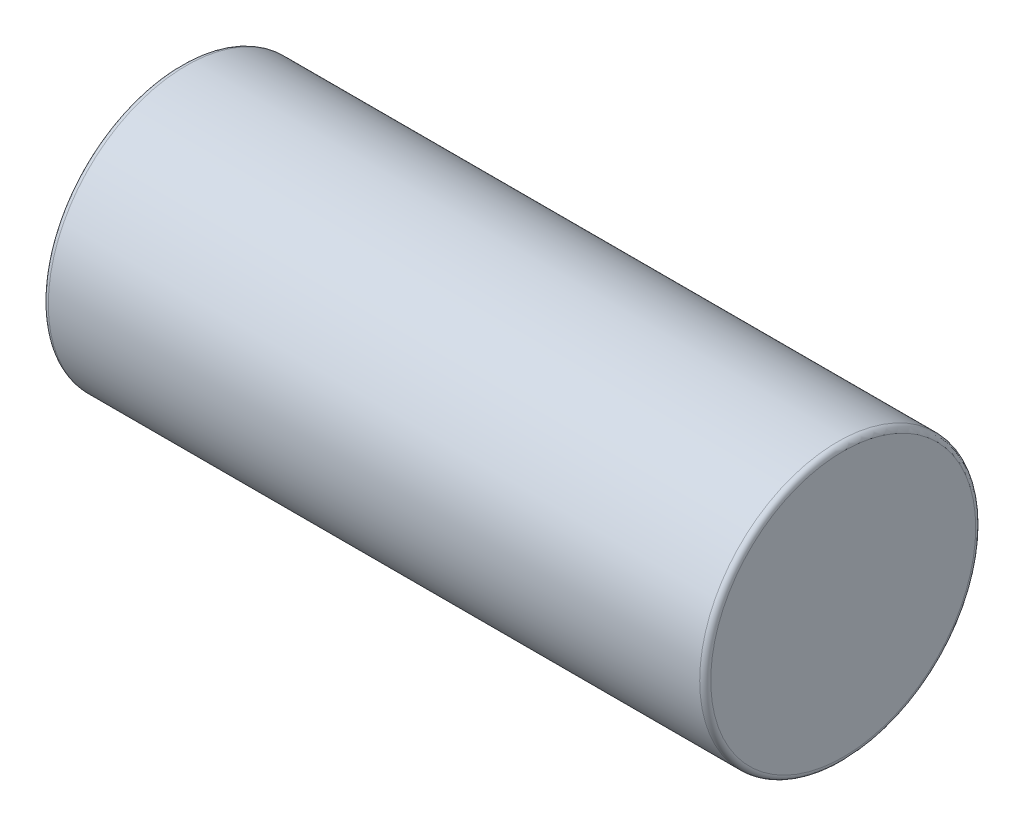
ISO-10303-21;
HEADER;
FILE_DESCRIPTION(('STEP AP214'),'2;1');
FILE_NAME('part.step','',(''),(''),'','','');
FILE_SCHEMA(('AUTOMOTIVE_DESIGN { 1 0 10303 214 1 1 1 1 }'));
ENDSEC;
DATA;
#1=APPLICATION_CONTEXT('core data for automotive mechanical design processes');
#2=APPLICATION_PROTOCOL_DEFINITION('international standard','automotive_design',2000,#1);
#3=PRODUCT_CONTEXT('',#1,'mechanical');
#4=PRODUCT('Part','Part','',(#3));
#5=PRODUCT_RELATED_PRODUCT_CATEGORY('part','',(#4));
#6=PRODUCT_DEFINITION_FORMATION('','',#4);
#7=PRODUCT_DEFINITION_CONTEXT('part definition',#1,'design');
#8=PRODUCT_DEFINITION('design','',#6,#7);
#9=PRODUCT_DEFINITION_SHAPE('','',#8);
#10=(LENGTH_UNIT() NAMED_UNIT(*) SI_UNIT(.MILLI.,.METRE.));
#11=(NAMED_UNIT(*) PLANE_ANGLE_UNIT() SI_UNIT($,.RADIAN.));
#12=(NAMED_UNIT(*) SI_UNIT($,.STERADIAN.) SOLID_ANGLE_UNIT());
#13=UNCERTAINTY_MEASURE_WITH_UNIT(LENGTH_MEASURE(1.E-05),#10,'distance_accuracy_value','');
#14=(GEOMETRIC_REPRESENTATION_CONTEXT(3) GLOBAL_UNCERTAINTY_ASSIGNED_CONTEXT((#13)) GLOBAL_UNIT_ASSIGNED_CONTEXT((#10,
#11,#12)) REPRESENTATION_CONTEXT('',''));
#15=CARTESIAN_POINT('',(0.,0.,0.));
#16=DIRECTION('',(0.,0.,1.));
#17=DIRECTION('',(1.,0.,0.));
#18=AXIS2_PLACEMENT_3D('',#15,#16,#17);
#19=CARTESIAN_POINT('',(152.4,0.,0.));
#20=DIRECTION('',(-1.,0.,0.));
#21=DIRECTION('',(0.,0.,1.));
#22=AXIS2_PLACEMENT_3D('',#19,#20,#21);
#23=CYLINDRICAL_SURFACE('',#22,63.5);
#24=CARTESIAN_POINT('',(-149.86,0.,0.));
#25=DIRECTION('',(1.,0.,0.));
#26=DIRECTION('',(0.,0.,-1.));
#27=AXIS2_PLACEMENT_3D('',#24,#25,#26);
#28=CIRCLE('',#27,63.5);
#29=CARTESIAN_POINT('',(-149.86,0.,63.5));
#30=VERTEX_POINT('',#29);
#31=EDGE_CURVE('E46',#30,#30,#28,.T.);
#32=CARTESIAN_POINT('',(149.86,0.,0.));
#33=DIRECTION('',(1.,0.,0.));
#34=DIRECTION('',(0.,0.,-1.));
#35=AXIS2_PLACEMENT_3D('',#32,#33,#34);
#36=CIRCLE('',#35,63.5);
#37=CARTESIAN_POINT('',(149.86,0.,63.5));
#38=VERTEX_POINT('',#37);
#39=EDGE_CURVE('E50',#38,#38,#36,.F.);
#40=CARTESIAN_POINT('',(-149.86,0.,63.5));
#41=CARTESIAN_POINT('',(-146.737916666667,0.,63.5));
#42=CARTESIAN_POINT('',(-143.615833333333,0.,63.5));
#43=CARTESIAN_POINT('',(-137.371666666667,0.,63.5));
#44=CARTESIAN_POINT('',(-134.249583333333,0.,63.5));
#45=CARTESIAN_POINT('',(-128.005416666667,0.,63.5));
#46=CARTESIAN_POINT('',(-124.883333333333,0.,63.5));
#47=CARTESIAN_POINT('',(-118.639166666667,0.,63.5));
#48=CARTESIAN_POINT('',(-115.517083333333,0.,63.5));
#49=CARTESIAN_POINT('',(-109.272916666667,0.,63.5));
#50=CARTESIAN_POINT('',(-106.150833333333,0.,63.5));
#51=CARTESIAN_POINT('',(-99.9066666666667,0.,63.5));
#52=CARTESIAN_POINT('',(-96.7845833333334,0.,63.5));
#53=CARTESIAN_POINT('',(-90.5404166666667,0.,63.5));
#54=CARTESIAN_POINT('',(-87.4183333333334,0.,63.5));
#55=CARTESIAN_POINT('',(-81.1741666666667,0.,63.5));
#56=CARTESIAN_POINT('',(-78.0520833333334,0.,63.5));
#57=CARTESIAN_POINT('',(-71.8079166666667,0.,63.5));
#58=CARTESIAN_POINT('',(-68.6858333333334,0.,63.5));
#59=CARTESIAN_POINT('',(-62.4416666666667,0.,63.5));
#60=CARTESIAN_POINT('',(-59.3195833333333,0.,63.5));
#61=CARTESIAN_POINT('',(-53.0754166666667,0.,63.5));
#62=CARTESIAN_POINT('',(-49.9533333333333,0.,63.5));
#63=CARTESIAN_POINT('',(-43.7091666666667,0.,63.5));
#64=CARTESIAN_POINT('',(-40.5870833333334,0.,63.5));
#65=CARTESIAN_POINT('',(-34.3429166666667,0.,63.5));
#66=CARTESIAN_POINT('',(-31.2208333333333,0.,63.5));
#67=CARTESIAN_POINT('',(-24.9766666666667,0.,63.5));
#68=CARTESIAN_POINT('',(-21.8545833333333,0.,63.5));
#69=CARTESIAN_POINT('',(-15.6104166666667,0.,63.5));
#70=CARTESIAN_POINT('',(-12.4883333333333,0.,63.5));
#71=CARTESIAN_POINT('',(-6.24416666666666,0.,63.5));
#72=CARTESIAN_POINT('',(-3.12208333333333,0.,63.5));
#73=CARTESIAN_POINT('',(3.12208333333333,0.,63.5));
#74=CARTESIAN_POINT('',(6.24416666666666,0.,63.5));
#75=CARTESIAN_POINT('',(12.4883333333333,0.,63.5));
#76=CARTESIAN_POINT('',(15.6104166666667,0.,63.5));
#77=CARTESIAN_POINT('',(21.8545833333333,0.,63.5));
#78=CARTESIAN_POINT('',(24.9766666666667,0.,63.5));
#79=CARTESIAN_POINT('',(31.2208333333333,0.,63.5));
#80=CARTESIAN_POINT('',(34.3429166666667,0.,63.5));
#81=CARTESIAN_POINT('',(40.5870833333333,0.,63.5));
#82=CARTESIAN_POINT('',(43.7091666666667,0.,63.5));
#83=CARTESIAN_POINT('',(49.9533333333333,0.,63.5));
#84=CARTESIAN_POINT('',(53.0754166666667,0.,63.5));
#85=CARTESIAN_POINT('',(59.3195833333333,0.,63.5));
#86=CARTESIAN_POINT('',(62.4416666666667,0.,63.5));
#87=CARTESIAN_POINT('',(68.6858333333333,0.,63.5));
#88=CARTESIAN_POINT('',(71.8079166666667,0.,63.5));
#89=CARTESIAN_POINT('',(78.0520833333333,0.,63.5));
#90=CARTESIAN_POINT('',(81.1741666666667,0.,63.5));
#91=CARTESIAN_POINT('',(87.4183333333333,0.,63.5));
#92=CARTESIAN_POINT('',(90.5404166666667,0.,63.5));
#93=CARTESIAN_POINT('',(96.7845833333334,0.,63.5));
#94=CARTESIAN_POINT('',(99.9066666666667,0.,63.5));
#95=CARTESIAN_POINT('',(106.150833333333,0.,63.5));
#96=CARTESIAN_POINT('',(109.272916666667,0.,63.5));
#97=CARTESIAN_POINT('',(115.517083333333,0.,63.5));
#98=CARTESIAN_POINT('',(118.639166666667,0.,63.5));
#99=CARTESIAN_POINT('',(124.883333333333,0.,63.5));
#100=CARTESIAN_POINT('',(128.005416666667,0.,63.5));
#101=CARTESIAN_POINT('',(134.249583333333,0.,63.5));
#102=CARTESIAN_POINT('',(137.371666666667,0.,63.5));
#103=CARTESIAN_POINT('',(143.615833333333,0.,63.5));
#104=CARTESIAN_POINT('',(146.737916666667,0.,63.5));
#105=CARTESIAN_POINT('',(149.86,0.,63.5));
#106=B_SPLINE_CURVE_WITH_KNOTS('',3,(#40,#41,#42,#43,#44,#45,#46,#47,#48,#49,#50,#51,#52,#53,
#54,#55,#56,#57,#58,#59,#60,#61,#62,#63,#64,#65,#66,#67,#68,#69,#70,#71,#72,#73,#74,#75,#76,#77,
#78,#79,#80,#81,#82,#83,#84,#85,#86,#87,#88,#89,#90,#91,#92,#93,#94,#95,#96,#97,#98,#99,#100,
#101,#102,#103,#104,#105),.UNSPECIFIED.,.F.,.F.,(4,2,2,2,2,2,2,2,2,2,2,2,2,2,2,2,2,2,2,2,2,2,2,
2,2,2,2,2,2,2,2,2,4),(0.,9.36625000000002,18.7325,28.09875,37.465,46.83125,56.1975,65.56375,
74.93,84.29625,93.6625,103.02875,112.395,121.76125,131.1275,140.49375,149.86,159.22625,168.5925,
177.95875,187.325,196.69125,206.0575,215.42375,224.79,234.15625,243.5225,252.88875,262.255,
271.62125,280.9875,290.35375,299.72),.UNSPECIFIED.);
#107=EDGE_CURVE('BSEAM35',#30,#38,#106,.T.);
#108=ORIENTED_EDGE('',*,*,#31,.T.);
#109=ORIENTED_EDGE('',*,*,#39,.T.);
#110=ORIENTED_EDGE('',*,*,#107,.T.);
#111=ORIENTED_EDGE('',*,*,#107,.F.);
#112=EDGE_LOOP('',(#108,#110,#109,#111));
#113=FACE_BOUND('',#112,.T.);
#114=ADVANCED_FACE('F35',(#113),#23,.T.);
#115=CARTESIAN_POINT('',(152.4,0.,0.));
#116=DIRECTION('',(1.,0.,0.));
#117=DIRECTION('',(0.,0.,-1.));
#118=AXIS2_PLACEMENT_3D('',#115,#116,#117);
#119=PLANE('',#118);
#120=CARTESIAN_POINT('',(152.4,0.,0.));
#121=DIRECTION('',(1.,0.,0.));
#122=DIRECTION('',(0.,0.,-1.));
#123=AXIS2_PLACEMENT_3D('',#120,#121,#122);
#124=CIRCLE('',#123,60.96);
#125=CARTESIAN_POINT('',(152.4,0.,-60.96));
#126=VERTEX_POINT('',#125);
#127=EDGE_CURVE('E10',#126,#126,#124,.T.);
#128=ORIENTED_EDGE('',*,*,#127,.T.);
#129=EDGE_LOOP('',(#128));
#130=FACE_BOUND('',#129,.T.);
#131=ADVANCED_FACE('F66',(#130),#119,.T.);
#132=CARTESIAN_POINT('',(-152.4,0.,0.));
#133=DIRECTION('',(1.,0.,0.));
#134=DIRECTION('',(0.,0.,-1.));
#135=AXIS2_PLACEMENT_3D('',#132,#133,#134);
#136=PLANE('',#135);
#137=CARTESIAN_POINT('',(-152.4,0.,0.));
#138=DIRECTION('',(1.,0.,0.));
#139=DIRECTION('',(0.,0.,-1.));
#140=AXIS2_PLACEMENT_3D('',#137,#138,#139);
#141=CIRCLE('',#140,60.96);
#142=CARTESIAN_POINT('',(-152.4,0.,-60.96));
#143=VERTEX_POINT('',#142);
#144=EDGE_CURVE('E42',#143,#143,#141,.F.);
#145=ORIENTED_EDGE('',*,*,#144,.T.);
#146=EDGE_LOOP('',(#145));
#147=FACE_BOUND('',#146,.T.);
#148=ADVANCED_FACE('F63',(#147),#136,.F.);
#149=CARTESIAN_POINT('',(-149.86,0.,0.));
#150=DIRECTION('',(1.,0.,0.));
#151=DIRECTION('',(0.,0.,-1.));
#152=AXIS2_PLACEMENT_3D('',#149,#150,#151);
#153=TOROIDAL_SURFACE('',#152,60.96,2.54);
#154=ORIENTED_EDGE('',*,*,#144,.F.);
#155=EDGE_LOOP('',(#154));
#156=FACE_BOUND('',#155,.T.);
#157=ORIENTED_EDGE('',*,*,#31,.F.);
#158=EDGE_LOOP('',(#157));
#159=FACE_BOUND('',#158,.T.);
#160=ADVANCED_FACE('F59',(#156,#159),#153,.T.);
#161=CARTESIAN_POINT('',(149.86,0.,0.));
#162=DIRECTION('',(1.,0.,0.));
#163=DIRECTION('',(0.,0.,-1.));
#164=AXIS2_PLACEMENT_3D('',#161,#162,#163);
#165=TOROIDAL_SURFACE('',#164,60.96,2.54);
#166=ORIENTED_EDGE('',*,*,#39,.F.);
#167=EDGE_LOOP('',(#166));
#168=FACE_BOUND('',#167,.T.);
#169=ORIENTED_EDGE('',*,*,#127,.F.);
#170=EDGE_LOOP('',(#169));
#171=FACE_BOUND('',#170,.T.);
#172=ADVANCED_FACE('F37',(#168,#171),#165,.T.);
#173=CLOSED_SHELL('',(#114,#131,#148,#160,#172));
#174=MANIFOLD_SOLID_BREP('B2',#173);
#175=ADVANCED_BREP_SHAPE_REPRESENTATION('',(#18,#174),#14);
#176=SHAPE_DEFINITION_REPRESENTATION(#9,#175);
ENDSEC;
END-ISO-10303-21;
